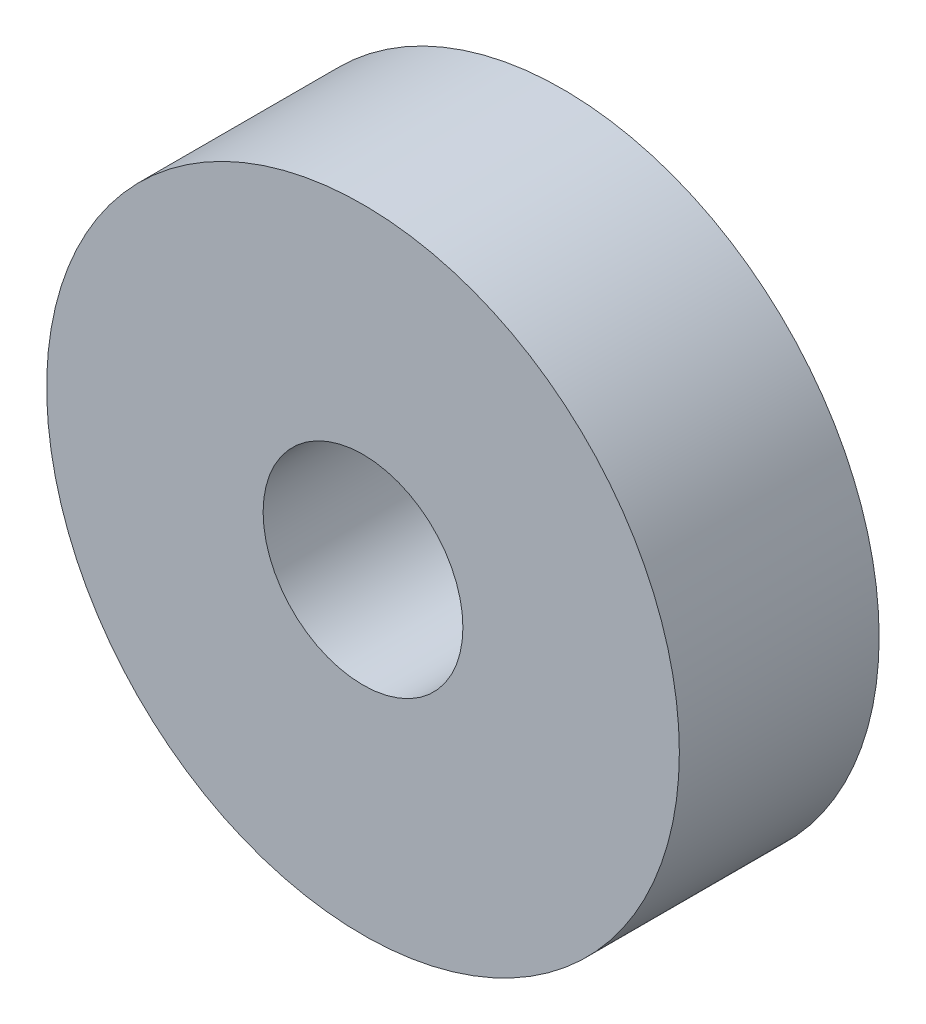
ISO-10303-21;
HEADER;
FILE_DESCRIPTION(('STEP AP214'),'2;1');
FILE_NAME('part.step','',(''),(''),'','','');
FILE_SCHEMA(('AUTOMOTIVE_DESIGN { 1 0 10303 214 1 1 1 1 }'));
ENDSEC;
DATA;
#1=APPLICATION_CONTEXT('core data for automotive mechanical design processes');
#2=APPLICATION_PROTOCOL_DEFINITION('international standard','automotive_design',2000,#1);
#3=PRODUCT_CONTEXT('',#1,'mechanical');
#4=PRODUCT('Part','Part','',(#3));
#5=PRODUCT_RELATED_PRODUCT_CATEGORY('part','',(#4));
#6=PRODUCT_DEFINITION_FORMATION('','',#4);
#7=PRODUCT_DEFINITION_CONTEXT('part definition',#1,'design');
#8=PRODUCT_DEFINITION('design','',#6,#7);
#9=PRODUCT_DEFINITION_SHAPE('','',#8);
#10=(LENGTH_UNIT() NAMED_UNIT(*) SI_UNIT(.MILLI.,.METRE.));
#11=(NAMED_UNIT(*) PLANE_ANGLE_UNIT() SI_UNIT($,.RADIAN.));
#12=(NAMED_UNIT(*) SI_UNIT($,.STERADIAN.) SOLID_ANGLE_UNIT());
#13=UNCERTAINTY_MEASURE_WITH_UNIT(LENGTH_MEASURE(1.E-05),#10,'distance_accuracy_value','');
#14=(GEOMETRIC_REPRESENTATION_CONTEXT(3) GLOBAL_UNCERTAINTY_ASSIGNED_CONTEXT((#13)) GLOBAL_UNIT_ASSIGNED_CONTEXT((#10,
#11,#12)) REPRESENTATION_CONTEXT('',''));
#15=CARTESIAN_POINT('',(0.,0.,0.));
#16=DIRECTION('',(0.,0.,1.));
#17=DIRECTION('',(1.,0.,0.));
#18=AXIS2_PLACEMENT_3D('',#15,#16,#17);
#19=CARTESIAN_POINT('',(0.,0.,0.));
#20=DIRECTION('',(0.,0.,1.));
#21=DIRECTION('',(1.,0.,0.));
#22=AXIS2_PLACEMENT_3D('',#19,#20,#21);
#23=CYLINDRICAL_SURFACE('',#22,3.);
#24=CARTESIAN_POINT('',(0.,0.,-6.));
#25=DIRECTION('',(0.,0.,1.));
#26=DIRECTION('',(1.,0.,0.));
#27=AXIS2_PLACEMENT_3D('',#24,#25,#26);
#28=CIRCLE('',#27,3.);
#29=CARTESIAN_POINT('',(3.,0.,-6.));
#30=VERTEX_POINT('',#29);
#31=EDGE_CURVE('E49',#30,#30,#28,.T.);
#32=ORIENTED_EDGE('',*,*,#31,.F.);
#33=EDGE_LOOP('',(#32));
#34=FACE_BOUND('',#33,.T.);
#35=CARTESIAN_POINT('',(0.,0.,0.));
#36=DIRECTION('',(0.,0.,1.));
#37=DIRECTION('',(1.,0.,0.));
#38=AXIS2_PLACEMENT_3D('',#35,#36,#37);
#39=CIRCLE('',#38,3.);
#40=CARTESIAN_POINT('',(3.,0.,0.));
#41=VERTEX_POINT('',#40);
#42=EDGE_CURVE('E10',#41,#41,#39,.T.);
#43=ORIENTED_EDGE('',*,*,#42,.T.);
#44=EDGE_LOOP('',(#43));
#45=FACE_BOUND('',#44,.T.);
#46=ADVANCED_FACE('F34',(#34,#45),#23,.F.);
#47=CARTESIAN_POINT('',(-3.,0.,0.));
#48=DIRECTION('',(0.,0.,-1.));
#49=DIRECTION('',(-1.,0.,0.));
#50=AXIS2_PLACEMENT_3D('',#47,#48,#49);
#51=PLANE('',#50);
#52=ORIENTED_EDGE('',*,*,#42,.F.);
#53=EDGE_LOOP('',(#52));
#54=FACE_BOUND('',#53,.T.);
#55=CARTESIAN_POINT('',(0.,0.,0.));
#56=DIRECTION('',(0.,0.,1.));
#57=DIRECTION('',(1.,0.,0.));
#58=AXIS2_PLACEMENT_3D('',#55,#56,#57);
#59=CIRCLE('',#58,9.5);
#60=CARTESIAN_POINT('',(9.5,0.,0.));
#61=VERTEX_POINT('',#60);
#62=EDGE_CURVE('E41',#61,#61,#59,.T.);
#63=ORIENTED_EDGE('',*,*,#62,.T.);
#64=EDGE_LOOP('',(#63));
#65=FACE_BOUND('',#64,.T.);
#66=ADVANCED_FACE('F58',(#54,#65),#51,.F.);
#67=CARTESIAN_POINT('',(0.,0.,0.));
#68=DIRECTION('',(0.,0.,1.));
#69=DIRECTION('',(1.,0.,0.));
#70=AXIS2_PLACEMENT_3D('',#67,#68,#69);
#71=CYLINDRICAL_SURFACE('',#70,9.5);
#72=ORIENTED_EDGE('',*,*,#62,.F.);
#73=EDGE_LOOP('',(#72));
#74=FACE_BOUND('',#73,.T.);
#75=CARTESIAN_POINT('',(0.,0.,-6.));
#76=DIRECTION('',(0.,0.,1.));
#77=DIRECTION('',(1.,0.,0.));
#78=AXIS2_PLACEMENT_3D('',#75,#76,#77);
#79=CIRCLE('',#78,9.5);
#80=CARTESIAN_POINT('',(9.5,0.,-6.));
#81=VERTEX_POINT('',#80);
#82=EDGE_CURVE('E45',#81,#81,#79,.T.);
#83=ORIENTED_EDGE('',*,*,#82,.T.);
#84=EDGE_LOOP('',(#83));
#85=FACE_BOUND('',#84,.T.);
#86=ADVANCED_FACE('F62',(#74,#85),#71,.T.);
#87=CARTESIAN_POINT('',(-9.5,0.,-6.));
#88=DIRECTION('',(0.,0.,1.));
#89=DIRECTION('',(1.,0.,0.));
#90=AXIS2_PLACEMENT_3D('',#87,#88,#89);
#91=PLANE('',#90);
#92=ORIENTED_EDGE('',*,*,#82,.F.);
#93=EDGE_LOOP('',(#92));
#94=FACE_BOUND('',#93,.T.);
#95=ORIENTED_EDGE('',*,*,#31,.T.);
#96=EDGE_LOOP('',(#95));
#97=FACE_BOUND('',#96,.T.);
#98=ADVANCED_FACE('F55',(#94,#97),#91,.F.);
#99=CLOSED_SHELL('',(#46,#66,#86,#98));
#100=CARTESIAN_POINT('',(0.,0.,-3.));
#101=DIRECTION('',(0.,0.,1.));
#102=DIRECTION('',(1.,0.,0.));
#103=AXIS2_PLACEMENT_3D('',#100,#101,#102);
#104=TOROIDAL_SURFACE('',#103,5.75,1.5);
#105=CARTESIAN_POINT('',(7.25,0.,-3.));
#106=VERTEX_POINT('',#105);
#107=VERTEX_LOOP('',#106);
#108=FACE_BOUND('',#107,.T.);
#109=ADVANCED_FACE('F73',(#108),#104,.F.);
#110=CLOSED_SHELL('',(#109));
#111=ORIENTED_CLOSED_SHELL('',*,#110,.T.);
#112=BREP_WITH_VOIDS('B2',#99,(#111));
#113=ADVANCED_BREP_SHAPE_REPRESENTATION('',(#18,#112),#14);
#114=SHAPE_DEFINITION_REPRESENTATION(#9,#113);
ENDSEC;
END-ISO-10303-21;
